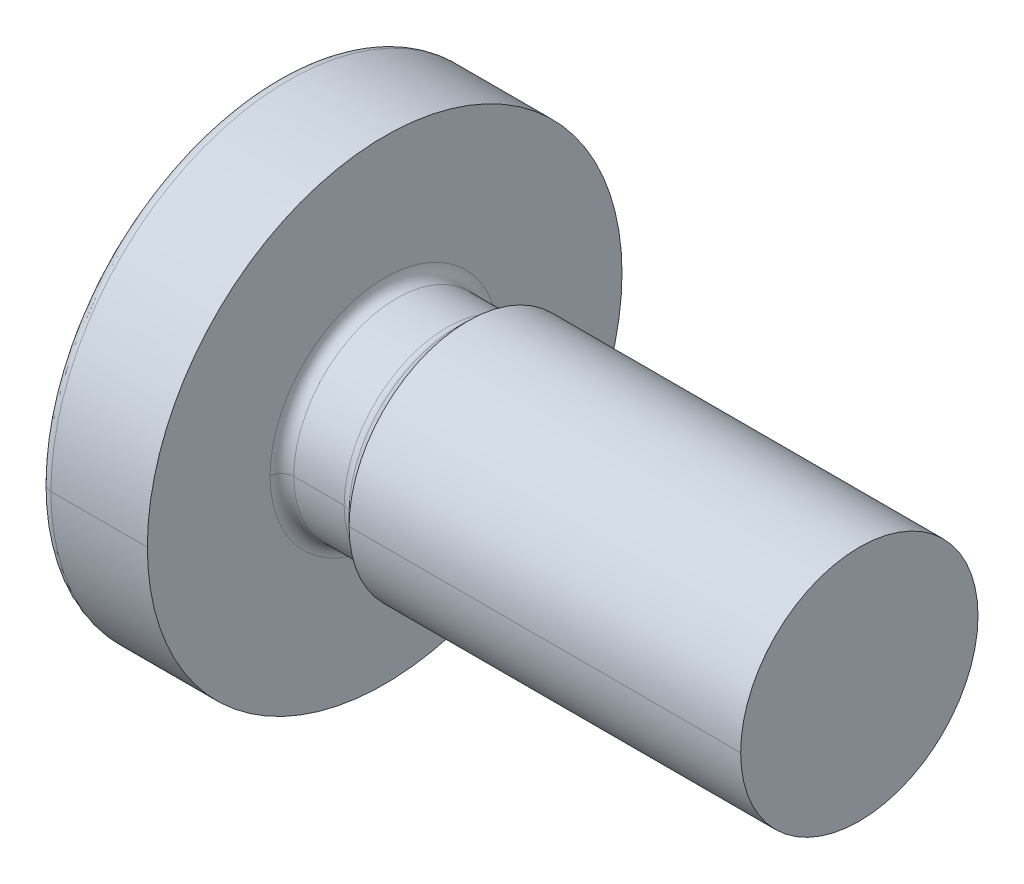
ISO-10303-21;
HEADER;
FILE_DESCRIPTION(('STEP AP214'),'2;1');
FILE_NAME('part.step','',(''),(''),'','','');
FILE_SCHEMA(('AUTOMOTIVE_DESIGN { 1 0 10303 214 1 1 1 1 }'));
ENDSEC;
DATA;
#1=APPLICATION_CONTEXT('core data for automotive mechanical design processes');
#2=APPLICATION_PROTOCOL_DEFINITION('international standard','automotive_design',2000,#1);
#3=PRODUCT_CONTEXT('',#1,'mechanical');
#4=PRODUCT('Part','Part','',(#3));
#5=PRODUCT_RELATED_PRODUCT_CATEGORY('part','',(#4));
#6=PRODUCT_DEFINITION_FORMATION('','',#4);
#7=PRODUCT_DEFINITION_CONTEXT('part definition',#1,'design');
#8=PRODUCT_DEFINITION('design','',#6,#7);
#9=PRODUCT_DEFINITION_SHAPE('','',#8);
#10=(LENGTH_UNIT() NAMED_UNIT(*) SI_UNIT(.MILLI.,.METRE.));
#11=(NAMED_UNIT(*) PLANE_ANGLE_UNIT() SI_UNIT($,.RADIAN.));
#12=(NAMED_UNIT(*) SI_UNIT($,.STERADIAN.) SOLID_ANGLE_UNIT());
#13=UNCERTAINTY_MEASURE_WITH_UNIT(LENGTH_MEASURE(1.E-05),#10,'distance_accuracy_value','');
#14=(GEOMETRIC_REPRESENTATION_CONTEXT(3) GLOBAL_UNCERTAINTY_ASSIGNED_CONTEXT((#13)) GLOBAL_UNIT_ASSIGNED_CONTEXT((#10,
#11,#12)) REPRESENTATION_CONTEXT('',''));
#15=CARTESIAN_POINT('',(0.,0.,0.));
#16=DIRECTION('',(0.,0.,1.));
#17=DIRECTION('',(1.,0.,0.));
#18=AXIS2_PLACEMENT_3D('',#15,#16,#17);
#19=CARTESIAN_POINT('',(3.3,0.,0.));
#20=DIRECTION('',(-1.,0.,0.));
#21=DIRECTION('',(0.,0.,1.));
#22=AXIS2_PLACEMENT_3D('',#19,#20,#21);
#23=TOROIDAL_SURFACE('',#22,1.932,0.2);
#24=CARTESIAN_POINT('',(3.1,0.,0.));
#25=DIRECTION('',(-1.,0.,0.));
#26=DIRECTION('',(0.,0.,1.));
#27=AXIS2_PLACEMENT_3D('',#24,#25,#26);
#28=CIRCLE('',#27,1.932);
#29=CARTESIAN_POINT('',(3.1,0.,-1.932));
#30=VERTEX_POINT('',#29);
#31=CARTESIAN_POINT('',(3.1,0.,1.932));
#32=VERTEX_POINT('',#31);
#33=EDGE_CURVE('E38',#30,#32,#28,.T.);
#34=ORIENTED_EDGE('',*,*,#33,.F.);
#35=CARTESIAN_POINT('',(3.3,0.,-1.932));
#36=DIRECTION('',(0.,1.,0.));
#37=DIRECTION('',(0.,0.,1.));
#38=AXIS2_PLACEMENT_3D('',#35,#36,#37);
#39=CIRCLE('',#38,0.2);
#40=CARTESIAN_POINT('',(3.3,0.,-1.732));
#41=VERTEX_POINT('',#40);
#42=EDGE_CURVE('E10',#30,#41,#39,.T.);
#43=ORIENTED_EDGE('',*,*,#42,.T.);
#44=CARTESIAN_POINT('',(3.3,0.,0.));
#45=DIRECTION('',(1.,0.,0.));
#46=DIRECTION('',(0.,0.,1.));
#47=AXIS2_PLACEMENT_3D('',#44,#45,#46);
#48=CIRCLE('',#47,1.732);
#49=CARTESIAN_POINT('',(3.3,0.,1.732));
#50=VERTEX_POINT('',#49);
#51=EDGE_CURVE('E52',#50,#41,#48,.T.);
#52=ORIENTED_EDGE('',*,*,#51,.F.);
#53=CARTESIAN_POINT('',(3.3,0.,1.932));
#54=DIRECTION('',(0.,-1.,0.));
#55=DIRECTION('',(0.,0.,-1.));
#56=AXIS2_PLACEMENT_3D('',#53,#54,#55);
#57=CIRCLE('',#56,0.2);
#58=EDGE_CURVE('E259',#32,#50,#57,.T.);
#59=ORIENTED_EDGE('',*,*,#58,.F.);
#60=EDGE_LOOP('',(#34,#43,#52,#59));
#61=FACE_BOUND('',#60,.T.);
#62=ADVANCED_FACE('F15',(#61),#23,.F.);
#63=CARTESIAN_POINT('',(4.14915728752538,0.,0.));
#64=DIRECTION('',(-1.,0.,0.));
#65=DIRECTION('',(0.,0.,1.));
#66=AXIS2_PLACEMENT_3D('',#63,#64,#65);
#67=TOROIDAL_SURFACE('',#66,1.932,0.2);
#68=CARTESIAN_POINT('',(4.14915728752538,0.,0.));
#69=DIRECTION('',(-1.,0.,0.));
#70=DIRECTION('',(0.,0.,1.));
#71=AXIS2_PLACEMENT_3D('',#68,#69,#70);
#72=CIRCLE('',#71,1.732);
#73=CARTESIAN_POINT('',(4.14915728752538,0.,-1.732));
#74=VERTEX_POINT('',#73);
#75=CARTESIAN_POINT('',(4.14915728752538,0.,1.732));
#76=VERTEX_POINT('',#75);
#77=EDGE_CURVE('E436',#74,#76,#72,.T.);
#78=ORIENTED_EDGE('',*,*,#77,.F.);
#79=CARTESIAN_POINT('',(4.14915728752538,0.,-1.932));
#80=DIRECTION('',(0.,1.,0.));
#81=DIRECTION('',(0.,0.,1.));
#82=AXIS2_PLACEMENT_3D('',#79,#80,#81);
#83=CIRCLE('',#82,0.2);
#84=CARTESIAN_POINT('',(4.29057864376269,0.,-1.79057864376269));
#85=VERTEX_POINT('',#84);
#86=EDGE_CURVE('E25',#74,#85,#83,.T.);
#87=ORIENTED_EDGE('',*,*,#86,.T.);
#88=CARTESIAN_POINT('',(4.29057864376269,0.,0.));
#89=DIRECTION('',(1.,0.,0.));
#90=DIRECTION('',(0.,0.,-1.));
#91=AXIS2_PLACEMENT_3D('',#88,#89,#90);
#92=CIRCLE('',#91,1.79057864376269);
#93=CARTESIAN_POINT('',(4.29057864376269,0.,1.79057864376269));
#94=VERTEX_POINT('',#93);
#95=EDGE_CURVE('E457',#94,#85,#92,.T.);
#96=ORIENTED_EDGE('',*,*,#95,.F.);
#97=CARTESIAN_POINT('',(4.14915728752538,0.,1.932));
#98=DIRECTION('',(0.,-1.,0.));
#99=DIRECTION('',(0.,0.,-1.));
#100=AXIS2_PLACEMENT_3D('',#97,#98,#99);
#101=CIRCLE('',#100,0.2);
#102=EDGE_CURVE('E262',#76,#94,#101,.T.);
#103=ORIENTED_EDGE('',*,*,#102,.F.);
#104=EDGE_LOOP('',(#78,#87,#96,#103));
#105=FACE_BOUND('',#104,.T.);
#106=ADVANCED_FACE('F1135',(#105),#67,.F.);
#107=CARTESIAN_POINT('',(1.47506218943955,0.,0.));
#108=DIRECTION('',(1.,0.,0.));
#109=DIRECTION('',(0.,0.,-1.));
#110=AXIS2_PLACEMENT_3D('',#107,#108,#109);
#111=TOROIDAL_SURFACE('',#110,3.8,0.2);
#112=CARTESIAN_POINT('',(1.31554035418367,0.,0.));
#113=DIRECTION('',(-1.,0.,0.));
#114=DIRECTION('',(0.,0.,-1.));
#115=AXIS2_PLACEMENT_3D('',#112,#113,#114);
#116=CIRCLE('',#115,3.92063492063492);
#117=CARTESIAN_POINT('',(1.31554035418367,0.,3.92063492063492));
#118=VERTEX_POINT('',#117);
#119=CARTESIAN_POINT('',(1.31554035418367,3.92063492063492,0.));
#120=VERTEX_POINT('',#119);
#121=EDGE_CURVE('E300',#118,#120,#116,.T.);
#122=ORIENTED_EDGE('',*,*,#121,.F.);
#123=CARTESIAN_POINT('',(1.47506218943955,0.,3.8));
#124=DIRECTION('',(0.,1.,0.));
#125=DIRECTION('',(0.,0.,1.));
#126=AXIS2_PLACEMENT_3D('',#123,#124,#125);
#127=CIRCLE('',#126,0.2);
#128=CARTESIAN_POINT('',(1.47506218943955,0.,4.));
#129=VERTEX_POINT('',#128);
#130=EDGE_CURVE('E539',#118,#129,#127,.T.);
#131=ORIENTED_EDGE('',*,*,#130,.T.);
#132=CARTESIAN_POINT('',(1.47506218943955,0.,0.));
#133=DIRECTION('',(1.,0.,0.));
#134=DIRECTION('',(0.,0.,-1.));
#135=AXIS2_PLACEMENT_3D('',#132,#133,#134);
#136=CIRCLE('',#135,4.);
#137=CARTESIAN_POINT('',(1.47506218943955,0.,-4.));
#138=VERTEX_POINT('',#137);
#139=EDGE_CURVE('E304',#138,#129,#136,.T.);
#140=ORIENTED_EDGE('',*,*,#139,.F.);
#141=CARTESIAN_POINT('',(1.47506218943955,0.,-3.8));
#142=DIRECTION('',(0.,-1.,0.));
#143=DIRECTION('',(0.,0.,-1.));
#144=AXIS2_PLACEMENT_3D('',#141,#142,#143);
#145=CIRCLE('',#144,0.2);
#146=CARTESIAN_POINT('',(1.31554035418367,0.,-3.92063492063492));
#147=VERTEX_POINT('',#146);
#148=EDGE_CURVE('E310',#147,#138,#145,.T.);
#149=ORIENTED_EDGE('',*,*,#148,.F.);
#150=CARTESIAN_POINT('',(1.31554035418367,0.,0.));
#151=DIRECTION('',(-1.,0.,0.));
#152=DIRECTION('',(0.,0.,-1.));
#153=AXIS2_PLACEMENT_3D('',#150,#151,#152);
#154=CIRCLE('',#153,3.92063492063492);
#155=EDGE_CURVE('E309',#120,#147,#154,.T.);
#156=ORIENTED_EDGE('',*,*,#155,.F.);
#157=EDGE_LOOP('',(#122,#131,#140,#149,#156));
#158=FACE_BOUND('',#157,.T.);
#159=ADVANCED_FACE('F605',(#158),#111,.T.);
#160=CARTESIAN_POINT('',(-3.4420013783492,0.,0.));
#161=DIRECTION('',(-1.,0.,0.));
#162=DIRECTION('',(0.,0.,1.));
#163=AXIS2_PLACEMENT_3D('',#160,#161,#162);
#164=CYLINDRICAL_SURFACE('',#163,2.);
#165=CARTESIAN_POINT('',(11.1,0.,0.));
#166=DIRECTION('',(-1.,0.,0.));
#167=DIRECTION('',(0.,0.,1.));
#168=AXIS2_PLACEMENT_3D('',#165,#166,#167);
#169=CIRCLE('',#168,2.);
#170=CARTESIAN_POINT('',(11.1,0.,2.));
#171=VERTEX_POINT('',#170);
#172=CARTESIAN_POINT('',(11.1,0.,-2.));
#173=VERTEX_POINT('',#172);
#174=EDGE_CURVE('E523',#171,#173,#169,.T.);
#175=ORIENTED_EDGE('',*,*,#174,.T.);
#176=DIRECTION('',(-1.,0.,0.));
#177=VECTOR('',#176,1.);
#178=CARTESIAN_POINT('',(-3.4420013783492,0.,-2.));
#179=LINE('',#178,#177);
#180=CARTESIAN_POINT('',(4.5,0.,-2.));
#181=VERTEX_POINT('',#180);
#182=EDGE_CURVE('E274',#173,#181,#179,.T.);
#183=ORIENTED_EDGE('',*,*,#182,.T.);
#184=CARTESIAN_POINT('',(4.5,0.,0.));
#185=DIRECTION('',(-1.,0.,0.));
#186=DIRECTION('',(0.,0.,1.));
#187=AXIS2_PLACEMENT_3D('',#184,#185,#186);
#188=CIRCLE('',#187,2.);
#189=CARTESIAN_POINT('',(4.5,0.,2.));
#190=VERTEX_POINT('',#189);
#191=EDGE_CURVE('E423',#190,#181,#188,.T.);
#192=ORIENTED_EDGE('',*,*,#191,.F.);
#193=DIRECTION('',(-1.,0.,0.));
#194=VECTOR('',#193,1.);
#195=CARTESIAN_POINT('',(-3.4420013783492,0.,2.));
#196=LINE('',#195,#194);
#197=EDGE_CURVE('E281',#171,#190,#196,.T.);
#198=ORIENTED_EDGE('',*,*,#197,.F.);
#199=EDGE_LOOP('',(#175,#183,#192,#198));
#200=FACE_BOUND('',#199,.T.);
#201=ADVANCED_FACE('F1146',(#200),#164,.T.);
#202=CARTESIAN_POINT('',(4.5,0.,0.));
#203=DIRECTION('',(1.,0.,0.));
#204=DIRECTION('',(0.,0.,-1.));
#205=AXIS2_PLACEMENT_3D('',#202,#203,#204);
#206=CONICAL_SURFACE('',#205,2.,0.785398163397442);
#207=CARTESIAN_POINT('',(4.29057864376269,0.,0.));
#208=DIRECTION('',(1.,0.,0.));
#209=DIRECTION('',(0.,0.,-1.));
#210=AXIS2_PLACEMENT_3D('',#207,#208,#209);
#211=CIRCLE('',#210,1.79057864376269);
#212=EDGE_CURVE('E270',#85,#94,#211,.T.);
#213=ORIENTED_EDGE('',*,*,#212,.T.);
#214=DIRECTION('',(0.707106781186552,0.,0.707106781186543));
#215=VECTOR('',#214,1.);
#216=CARTESIAN_POINT('',(4.5,0.,2.));
#217=LINE('',#216,#215);
#218=EDGE_CURVE('E275',#94,#190,#217,.T.);
#219=ORIENTED_EDGE('',*,*,#218,.T.);
#220=ORIENTED_EDGE('',*,*,#191,.T.);
#221=DIRECTION('',(0.707106781186552,0.,-0.707106781186543));
#222=VECTOR('',#221,1.);
#223=CARTESIAN_POINT('',(4.5,0.,-2.));
#224=LINE('',#223,#222);
#225=EDGE_CURVE('E453',#85,#181,#224,.T.);
#226=ORIENTED_EDGE('',*,*,#225,.F.);
#227=EDGE_LOOP('',(#213,#219,#220,#226));
#228=FACE_BOUND('',#227,.T.);
#229=ADVANCED_FACE('F1151',(#228),#206,.T.);
#230=CARTESIAN_POINT('',(-3.4420013783492,0.,0.));
#231=DIRECTION('',(-1.,0.,0.));
#232=DIRECTION('',(0.,0.,1.));
#233=AXIS2_PLACEMENT_3D('',#230,#231,#232);
#234=CYLINDRICAL_SURFACE('',#233,1.732);
#235=CARTESIAN_POINT('',(4.14915728752538,0.,0.));
#236=DIRECTION('',(-1.,0.,0.));
#237=DIRECTION('',(0.,0.,1.));
#238=AXIS2_PLACEMENT_3D('',#235,#236,#237);
#239=CIRCLE('',#238,1.732);
#240=EDGE_CURVE('E409',#76,#74,#239,.T.);
#241=ORIENTED_EDGE('',*,*,#240,.T.);
#242=DIRECTION('',(-1.,0.,0.));
#243=VECTOR('',#242,1.);
#244=CARTESIAN_POINT('',(-3.4420013783492,0.,-1.732));
#245=LINE('',#244,#243);
#246=EDGE_CURVE('E406',#74,#41,#245,.T.);
#247=ORIENTED_EDGE('',*,*,#246,.T.);
#248=CARTESIAN_POINT('',(3.3,0.,0.));
#249=DIRECTION('',(1.,0.,0.));
#250=DIRECTION('',(0.,0.,1.));
#251=AXIS2_PLACEMENT_3D('',#248,#249,#250);
#252=CIRCLE('',#251,1.732);
#253=EDGE_CURVE('E391',#41,#50,#252,.T.);
#254=ORIENTED_EDGE('',*,*,#253,.T.);
#255=DIRECTION('',(-1.,0.,0.));
#256=VECTOR('',#255,1.);
#257=CARTESIAN_POINT('',(-3.4420013783492,0.,1.732));
#258=LINE('',#257,#256);
#259=EDGE_CURVE('E439',#76,#50,#258,.T.);
#260=ORIENTED_EDGE('',*,*,#259,.F.);
#261=EDGE_LOOP('',(#241,#247,#254,#260));
#262=FACE_BOUND('',#261,.T.);
#263=ADVANCED_FACE('F1088',(#262),#234,.T.);
#264=CARTESIAN_POINT('',(-3.4420013783492,0.,0.));
#265=DIRECTION('',(-1.,0.,0.));
#266=DIRECTION('',(0.,0.,1.));
#267=AXIS2_PLACEMENT_3D('',#264,#265,#266);
#268=CYLINDRICAL_SURFACE('',#267,4.);
#269=CARTESIAN_POINT('',(3.1,0.,0.));
#270=DIRECTION('',(-1.,0.,0.));
#271=DIRECTION('',(0.,0.,1.));
#272=AXIS2_PLACEMENT_3D('',#269,#270,#271);
#273=CIRCLE('',#272,4.);
#274=CARTESIAN_POINT('',(3.1,0.,4.));
#275=VERTEX_POINT('',#274);
#276=CARTESIAN_POINT('',(3.1,0.,-4.));
#277=VERTEX_POINT('',#276);
#278=EDGE_CURVE('E387',#275,#277,#273,.T.);
#279=ORIENTED_EDGE('',*,*,#278,.T.);
#280=DIRECTION('',(-1.,0.,0.));
#281=VECTOR('',#280,1.);
#282=CARTESIAN_POINT('',(-3.4420013783492,0.,-4.));
#283=LINE('',#282,#281);
#284=EDGE_CURVE('E308',#277,#138,#283,.T.);
#285=ORIENTED_EDGE('',*,*,#284,.T.);
#286=ORIENTED_EDGE('',*,*,#139,.T.);
#287=DIRECTION('',(-1.,0.,0.));
#288=VECTOR('',#287,1.);
#289=CARTESIAN_POINT('',(-3.4420013783492,0.,4.));
#290=LINE('',#289,#288);
#291=EDGE_CURVE('E282',#275,#129,#290,.T.);
#292=ORIENTED_EDGE('',*,*,#291,.F.);
#293=EDGE_LOOP('',(#279,#285,#286,#292));
#294=FACE_BOUND('',#293,.T.);
#295=ADVANCED_FACE('F608',(#294),#268,.T.);
#296=CARTESIAN_POINT('',(6.5,0.,0.));
#297=DIRECTION('',(0.,0.,-1.));
#298=DIRECTION('',(0.,1.,0.));
#299=AXIS2_PLACEMENT_3D('',#296,#297,#298);
#300=SPHERICAL_SURFACE('',#299,6.5);
#301=ORIENTED_EDGE('',*,*,#155,.T.);
#302=CARTESIAN_POINT('',(1.31554035418367,0.,0.));
#303=DIRECTION('',(-1.,0.,0.));
#304=DIRECTION('',(0.,0.,-1.));
#305=AXIS2_PLACEMENT_3D('',#302,#303,#304);
#306=CIRCLE('',#305,3.92063492063492);
#307=CARTESIAN_POINT('',(1.31554035418367,-3.92063492063492,0.));
#308=VERTEX_POINT('',#307);
#309=EDGE_CURVE('E320',#147,#308,#306,.T.);
#310=ORIENTED_EDGE('',*,*,#309,.T.);
#311=CARTESIAN_POINT('',(6.5,0.,0.));
#312=DIRECTION('',(0.,0.,-1.));
#313=DIRECTION('',(0.,1.,0.));
#314=AXIS2_PLACEMENT_3D('',#311,#312,#313);
#315=CIRCLE('',#314,6.5);
#316=CARTESIAN_POINT('',(0.0700305769772277,-0.951574074359006,0.));
#317=VERTEX_POINT('',#316);
#318=EDGE_CURVE('E235',#308,#317,#315,.T.);
#319=ORIENTED_EDGE('',*,*,#318,.T.);
#320=CARTESIAN_POINT('',(6.52789360657738,-0.292360173838381,0.112226556013255));
#321=DIRECTION('',(0.0887201386737615,-0.929898939158986,0.356954758960714));
#322=DIRECTION('',(0.,-0.358367949545295,-0.933580426497204));
#323=AXIS2_PLACEMENT_3D('',#320,#321,#322);
#324=CIRCLE('',#323,6.49239190711641);
#325=CARTESIAN_POINT('',(0.141888285622446,-1.1900033192439,-0.638989457439414));
#326=VERTEX_POINT('',#325);
#327=EDGE_CURVE('E227',#317,#326,#324,.T.);
#328=ORIENTED_EDGE('',*,*,#327,.T.);
#329=CARTESIAN_POINT('',(6.49834511100712,0.0173453236425445,-0.0167501843370009));
#330=DIRECTION('',(0.0684699703771079,-0.717651637719428,0.693028130767562));
#331=DIRECTION('',(0.,-0.694658370458996,-0.719339800338652));
#332=AXIS2_PLACEMENT_3D('',#329,#330,#331);
#333=CIRCLE('',#332,6.49995506387658);
#334=CARTESIAN_POINT('',(0.368688551321991,-1.75882202008378,-1.25042593582281));
#335=VERTEX_POINT('',#334);
#336=EDGE_CURVE('E218',#326,#335,#333,.T.);
#337=ORIENTED_EDGE('',*,*,#336,.T.);
#338=CARTESIAN_POINT('',(6.12899407355305,0.526174253500917,0.526174253500917));
#339=DIRECTION('',(-0.44619781450503,0.63281415531376,0.63281415531376));
#340=DIRECTION('',(0.,-0.707106781186548,0.707106781186547));
#341=AXIS2_PLACEMENT_3D('',#338,#339,#340);
#342=CIRCLE('',#341,6.44659878637152);
#343=CARTESIAN_POINT('',(0.368688551617876,-1.25042593573104,-1.75882201996693));
#344=VERTEX_POINT('',#343);
#345=EDGE_CURVE('E245',#344,#335,#342,.T.);
#346=ORIENTED_EDGE('',*,*,#345,.F.);
#347=CARTESIAN_POINT('',(6.49834511100712,-0.0167501843369975,0.017345323642541));
#348=DIRECTION('',(0.0684699703771073,0.693028130767561,-0.717651637719429));
#349=DIRECTION('',(0.,0.719339800338653,0.694658370458995));
#350=AXIS2_PLACEMENT_3D('',#347,#348,#349);
#351=CIRCLE('',#350,6.49995506387658);
#352=CARTESIAN_POINT('',(0.14188828559706,-0.638989457439414,-1.19000331924632));
#353=VERTEX_POINT('',#352);
#354=EDGE_CURVE('E228',#344,#353,#351,.T.);
#355=ORIENTED_EDGE('',*,*,#354,.T.);
#356=CARTESIAN_POINT('',(6.52789360657738,0.112226556013256,-0.292360173838384));
#357=DIRECTION('',(0.0887201386737611,0.356954758960714,-0.929898939158986));
#358=DIRECTION('',(0.,0.933580426497204,0.358367949545294));
#359=AXIS2_PLACEMENT_3D('',#356,#357,#358);
#360=CIRCLE('',#359,6.49239190711642);
#361=CARTESIAN_POINT('',(0.0700305769772277,0.,-0.951574074359006));
#362=VERTEX_POINT('',#361);
#363=EDGE_CURVE('E355',#353,#362,#360,.T.);
#364=ORIENTED_EDGE('',*,*,#363,.T.);
#365=CARTESIAN_POINT('',(6.52789360657738,-0.112226556013255,-0.292360173838382));
#366=DIRECTION('',(0.0887201386737613,-0.356954758960714,-0.929898939158986));
#367=DIRECTION('',(0.,0.933580426497204,-0.358367949545294));
#368=AXIS2_PLACEMENT_3D('',#365,#366,#367);
#369=CIRCLE('',#368,6.49239190711642);
#370=CARTESIAN_POINT('',(0.141888285622446,0.638989457439414,-1.1900033192439));
#371=VERTEX_POINT('',#370);
#372=EDGE_CURVE('E359',#362,#371,#369,.T.);
#373=ORIENTED_EDGE('',*,*,#372,.T.);
#374=CARTESIAN_POINT('',(6.49834511100712,0.016750184336999,0.0173453236425425));
#375=DIRECTION('',(0.0684699703771076,-0.693028130767562,-0.717651637719428));
#376=DIRECTION('',(0.,0.719339800338653,-0.694658370458996));
#377=AXIS2_PLACEMENT_3D('',#374,#375,#376);
#378=CIRCLE('',#377,6.49995506387658);
#379=CARTESIAN_POINT('',(0.36868855132199,1.25042593582281,-1.75882202008378));
#380=VERTEX_POINT('',#379);
#381=EDGE_CURVE('E413',#371,#380,#378,.T.);
#382=ORIENTED_EDGE('',*,*,#381,.T.);
#383=CARTESIAN_POINT('',(6.12899407355305,-0.526174253500917,0.526174253500917));
#384=DIRECTION('',(-0.44619781450503,-0.63281415531376,0.63281415531376));
#385=DIRECTION('',(0.,-0.707106781186548,-0.707106781186547));
#386=AXIS2_PLACEMENT_3D('',#383,#384,#385);
#387=CIRCLE('',#386,6.44659878637152);
#388=CARTESIAN_POINT('',(0.368688551321992,1.75882202008378,-1.25042593582281));
#389=VERTEX_POINT('',#388);
#390=EDGE_CURVE('E444',#389,#380,#387,.T.);
#391=ORIENTED_EDGE('',*,*,#390,.F.);
#392=CARTESIAN_POINT('',(6.49834511100712,-0.0173453236425436,-0.0167501843370001));
#393=DIRECTION('',(0.0684699703771077,0.717651637719428,0.693028130767562));
#394=DIRECTION('',(0.,-0.694658370458996,0.719339800338652));
#395=AXIS2_PLACEMENT_3D('',#392,#393,#394);
#396=CIRCLE('',#395,6.49995506387658);
#397=CARTESIAN_POINT('',(0.141888285597059,1.19000331924632,-0.638989457439414));
#398=VERTEX_POINT('',#397);
#399=EDGE_CURVE('E380',#389,#398,#396,.T.);
#400=ORIENTED_EDGE('',*,*,#399,.T.);
#401=CARTESIAN_POINT('',(6.52789360657738,0.292360173838382,0.112226556013255));
#402=DIRECTION('',(0.0887201386737614,0.929898939158986,0.356954758960714));
#403=DIRECTION('',(0.,-0.358367949545294,0.933580426497204));
#404=AXIS2_PLACEMENT_3D('',#401,#402,#403);
#405=CIRCLE('',#404,6.49239190711642);
#406=CARTESIAN_POINT('',(0.0700305769772277,0.951574074359006,0.));
#407=VERTEX_POINT('',#406);
#408=EDGE_CURVE('E376',#398,#407,#405,.T.);
#409=ORIENTED_EDGE('',*,*,#408,.T.);
#410=CARTESIAN_POINT('',(6.5,0.,0.));
#411=DIRECTION('',(0.,0.,1.));
#412=DIRECTION('',(1.,0.,0.));
#413=AXIS2_PLACEMENT_3D('',#410,#411,#412);
#414=CIRCLE('',#413,6.5);
#415=EDGE_CURVE('E291',#120,#407,#414,.T.);
#416=ORIENTED_EDGE('',*,*,#415,.F.);
#417=EDGE_LOOP('',(#301,#310,#319,#328,#337,#346,#355,#364,#373,#382,#391,#400,#409,#416));
#418=FACE_BOUND('',#417,.T.);
#419=ADVANCED_FACE('F233',(#418),#300,.T.);
#420=CARTESIAN_POINT('',(6.5,0.,0.));
#421=DIRECTION('',(0.,0.,-1.));
#422=DIRECTION('',(0.,1.,0.));
#423=AXIS2_PLACEMENT_3D('',#420,#421,#422);
#424=SPHERICAL_SURFACE('',#423,6.5);
#425=ORIENTED_EDGE('',*,*,#318,.F.);
#426=CARTESIAN_POINT('',(1.31554035418367,0.,0.));
#427=DIRECTION('',(-1.,0.,0.));
#428=DIRECTION('',(0.,0.,-1.));
#429=AXIS2_PLACEMENT_3D('',#426,#427,#428);
#430=CIRCLE('',#429,3.92063492063492);
#431=EDGE_CURVE('E381',#308,#118,#430,.T.);
#432=ORIENTED_EDGE('',*,*,#431,.T.);
#433=ORIENTED_EDGE('',*,*,#121,.T.);
#434=ORIENTED_EDGE('',*,*,#415,.T.);
#435=CARTESIAN_POINT('',(6.52789360657738,0.292360173838382,-0.112226556013255));
#436=DIRECTION('',(0.0887201386737614,0.929898939158986,-0.356954758960714));
#437=DIRECTION('',(0.,0.358367949545294,0.933580426497204));
#438=AXIS2_PLACEMENT_3D('',#435,#436,#437);
#439=CIRCLE('',#438,6.49239190711642);
#440=CARTESIAN_POINT('',(0.141888285622446,1.1900033192439,0.638989457439414));
#441=VERTEX_POINT('',#440);
#442=EDGE_CURVE('E287',#407,#441,#439,.T.);
#443=ORIENTED_EDGE('',*,*,#442,.T.);
#444=CARTESIAN_POINT('',(6.49834511100712,-0.0173453236425439,0.0167501843370004));
#445=DIRECTION('',(0.0684699703771078,0.717651637719428,-0.693028130767562));
#446=DIRECTION('',(0.,0.694658370458996,0.719339800338652));
#447=AXIS2_PLACEMENT_3D('',#444,#445,#446);
#448=CIRCLE('',#447,6.49995506387658);
#449=CARTESIAN_POINT('',(0.368688551321992,1.75882202008378,1.25042593582281));
#450=VERTEX_POINT('',#449);
#451=EDGE_CURVE('E292',#441,#450,#448,.T.);
#452=ORIENTED_EDGE('',*,*,#451,.T.);
#453=CARTESIAN_POINT('',(6.12899407355305,-0.526174253500917,-0.526174253500917));
#454=DIRECTION('',(-0.44619781450503,-0.63281415531376,-0.63281415531376));
#455=DIRECTION('',(0.,0.707106781186548,-0.707106781186547));
#456=AXIS2_PLACEMENT_3D('',#453,#454,#455);
#457=CIRCLE('',#456,6.44659878637152);
#458=CARTESIAN_POINT('',(0.368688551617876,1.25042593573104,1.75882201996693));
#459=VERTEX_POINT('',#458);
#460=EDGE_CURVE('E264',#459,#450,#457,.T.);
#461=ORIENTED_EDGE('',*,*,#460,.F.);
#462=CARTESIAN_POINT('',(6.49834511100712,0.0167501843369989,-0.0173453236425424));
#463=DIRECTION('',(0.0684699703771076,-0.693028130767562,0.717651637719428));
#464=DIRECTION('',(0.,-0.719339800338653,-0.694658370458996));
#465=AXIS2_PLACEMENT_3D('',#462,#463,#464);
#466=CIRCLE('',#465,6.49995506387658);
#467=CARTESIAN_POINT('',(0.141888285597059,0.638989457439414,1.19000331924632));
#468=VERTEX_POINT('',#467);
#469=EDGE_CURVE('E368',#459,#468,#466,.T.);
#470=ORIENTED_EDGE('',*,*,#469,.T.);
#471=CARTESIAN_POINT('',(6.52789360657738,-0.112226556013255,0.292360173838382));
#472=DIRECTION('',(0.0887201386737613,-0.356954758960714,0.929898939158986));
#473=DIRECTION('',(0.,-0.933580426497204,-0.358367949545294));
#474=AXIS2_PLACEMENT_3D('',#471,#472,#473);
#475=CIRCLE('',#474,6.49239190711642);
#476=CARTESIAN_POINT('',(0.0700305769772283,0.,0.951574074359006));
#477=VERTEX_POINT('',#476);
#478=EDGE_CURVE('E364',#468,#477,#475,.T.);
#479=ORIENTED_EDGE('',*,*,#478,.T.);
#480=CARTESIAN_POINT('',(6.52789360657738,0.112226556013256,0.292360173838384));
#481=DIRECTION('',(0.0887201386737611,0.356954758960714,0.929898939158986));
#482=DIRECTION('',(0.,-0.933580426497204,0.358367949545294));
#483=AXIS2_PLACEMENT_3D('',#480,#481,#482);
#484=CIRCLE('',#483,6.49239190711642);
#485=CARTESIAN_POINT('',(0.141888285622445,-0.638989457439414,1.1900033192439));
#486=VERTEX_POINT('',#485);
#487=EDGE_CURVE('E353',#477,#486,#484,.T.);
#488=ORIENTED_EDGE('',*,*,#487,.T.);
#489=CARTESIAN_POINT('',(6.49834511100712,-0.0167501843369975,-0.017345323642541));
#490=DIRECTION('',(0.0684699703771073,0.693028130767561,0.717651637719429));
#491=DIRECTION('',(0.,-0.719339800338653,0.694658370458995));
#492=AXIS2_PLACEMENT_3D('',#489,#490,#491);
#493=CIRCLE('',#492,6.49995506387658);
#494=CARTESIAN_POINT('',(0.368688551321991,-1.25042593582281,1.75882202008378));
#495=VERTEX_POINT('',#494);
#496=EDGE_CURVE('E349',#486,#495,#493,.T.);
#497=ORIENTED_EDGE('',*,*,#496,.T.);
#498=CARTESIAN_POINT('',(6.12899407355305,0.526174253500917,-0.526174253500917));
#499=DIRECTION('',(-0.44619781450503,0.63281415531376,-0.63281415531376));
#500=DIRECTION('',(0.,0.707106781186548,0.707106781186547));
#501=AXIS2_PLACEMENT_3D('',#498,#499,#500);
#502=CIRCLE('',#501,6.44659878637152);
#503=CARTESIAN_POINT('',(0.368688551617877,-1.75882201996693,1.25042593573104));
#504=VERTEX_POINT('',#503);
#505=EDGE_CURVE('E319',#504,#495,#502,.T.);
#506=ORIENTED_EDGE('',*,*,#505,.F.);
#507=CARTESIAN_POINT('',(6.49834511100712,0.0173453236425442,0.0167501843370007));
#508=DIRECTION('',(0.0684699703771078,-0.717651637719428,-0.693028130767562));
#509=DIRECTION('',(0.,0.694658370458996,-0.719339800338652));
#510=AXIS2_PLACEMENT_3D('',#507,#508,#509);
#511=CIRCLE('',#510,6.49995506387658);
#512=CARTESIAN_POINT('',(0.141888285597059,-1.19000331924632,0.638989457439414));
#513=VERTEX_POINT('',#512);
#514=EDGE_CURVE('E354',#504,#513,#511,.T.);
#515=ORIENTED_EDGE('',*,*,#514,.T.);
#516=CARTESIAN_POINT('',(6.52789360657738,-0.292360173838381,-0.112226556013255));
#517=DIRECTION('',(0.0887201386737615,-0.929898939158986,-0.356954758960714));
#518=DIRECTION('',(0.,0.358367949545294,-0.933580426497204));
#519=AXIS2_PLACEMENT_3D('',#516,#517,#518);
#520=CIRCLE('',#519,6.49239190711642);
#521=EDGE_CURVE('E414',#513,#317,#520,.T.);
#522=ORIENTED_EDGE('',*,*,#521,.T.);
#523=EDGE_LOOP('',(#425,#432,#433,#434,#443,#452,#461,#470,#479,#488,#497,#506,#515,#522));
#524=FACE_BOUND('',#523,.T.);
#525=ADVANCED_FACE('F576',(#524),#424,.T.);
#526=CARTESIAN_POINT('',(-3.4420013783492,0.,0.));
#527=DIRECTION('',(-1.,0.,0.));
#528=DIRECTION('',(0.,0.,1.));
#529=AXIS2_PLACEMENT_3D('',#526,#527,#528);
#530=CYLINDRICAL_SURFACE('',#529,4.);
#531=ORIENTED_EDGE('',*,*,#284,.F.);
#532=CARTESIAN_POINT('',(3.1,0.,0.));
#533=DIRECTION('',(-1.,0.,0.));
#534=DIRECTION('',(0.,0.,1.));
#535=AXIS2_PLACEMENT_3D('',#532,#533,#534);
#536=CIRCLE('',#535,4.);
#537=EDGE_CURVE('E284',#277,#275,#536,.T.);
#538=ORIENTED_EDGE('',*,*,#537,.T.);
#539=ORIENTED_EDGE('',*,*,#291,.T.);
#540=CARTESIAN_POINT('',(1.47506218943955,0.,0.));
#541=DIRECTION('',(1.,0.,0.));
#542=DIRECTION('',(0.,0.,-1.));
#543=AXIS2_PLACEMENT_3D('',#540,#541,#542);
#544=CIRCLE('',#543,4.);
#545=EDGE_CURVE('E285',#129,#138,#544,.T.);
#546=ORIENTED_EDGE('',*,*,#545,.T.);
#547=EDGE_LOOP('',(#531,#538,#539,#546));
#548=FACE_BOUND('',#547,.T.);
#549=ADVANCED_FACE('F612',(#548),#530,.T.);
#550=CARTESIAN_POINT('',(3.1,4.,0.));
#551=DIRECTION('',(-1.,0.,0.));
#552=DIRECTION('',(0.,0.,1.));
#553=AXIS2_PLACEMENT_3D('',#550,#551,#552);
#554=PLANE('',#553);
#555=ORIENTED_EDGE('',*,*,#278,.F.);
#556=ORIENTED_EDGE('',*,*,#537,.F.);
#557=EDGE_LOOP('',(#555,#556));
#558=FACE_BOUND('',#557,.T.);
#559=CARTESIAN_POINT('',(3.1,0.,0.));
#560=DIRECTION('',(-1.,0.,0.));
#561=DIRECTION('',(0.,0.,1.));
#562=AXIS2_PLACEMENT_3D('',#559,#560,#561);
#563=CIRCLE('',#562,1.932);
#564=EDGE_CURVE('E326',#32,#30,#563,.T.);
#565=ORIENTED_EDGE('',*,*,#564,.T.);
#566=ORIENTED_EDGE('',*,*,#33,.T.);
#567=EDGE_LOOP('',(#565,#566));
#568=FACE_BOUND('',#567,.T.);
#569=ADVANCED_FACE('F616',(#558,#568),#554,.F.);
#570=CARTESIAN_POINT('',(-3.4420013783492,0.,0.));
#571=DIRECTION('',(-1.,0.,0.));
#572=DIRECTION('',(0.,0.,1.));
#573=AXIS2_PLACEMENT_3D('',#570,#571,#572);
#574=CYLINDRICAL_SURFACE('',#573,1.732);
#575=ORIENTED_EDGE('',*,*,#246,.F.);
#576=ORIENTED_EDGE('',*,*,#77,.T.);
#577=ORIENTED_EDGE('',*,*,#259,.T.);
#578=ORIENTED_EDGE('',*,*,#51,.T.);
#579=EDGE_LOOP('',(#575,#576,#577,#578));
#580=FACE_BOUND('',#579,.T.);
#581=ADVANCED_FACE('F619',(#580),#574,.T.);
#582=CARTESIAN_POINT('',(4.5,0.,0.));
#583=DIRECTION('',(1.,0.,0.));
#584=DIRECTION('',(0.,0.,-1.));
#585=AXIS2_PLACEMENT_3D('',#582,#583,#584);
#586=CONICAL_SURFACE('',#585,2.,0.785398163397442);
#587=ORIENTED_EDGE('',*,*,#218,.F.);
#588=ORIENTED_EDGE('',*,*,#95,.T.);
#589=ORIENTED_EDGE('',*,*,#225,.T.);
#590=CARTESIAN_POINT('',(4.5,0.,0.));
#591=DIRECTION('',(-1.,0.,0.));
#592=DIRECTION('',(0.,0.,1.));
#593=AXIS2_PLACEMENT_3D('',#590,#591,#592);
#594=CIRCLE('',#593,2.);
#595=EDGE_CURVE('E280',#181,#190,#594,.T.);
#596=ORIENTED_EDGE('',*,*,#595,.T.);
#597=EDGE_LOOP('',(#587,#588,#589,#596));
#598=FACE_BOUND('',#597,.T.);
#599=ADVANCED_FACE('F1169',(#598),#586,.T.);
#600=CARTESIAN_POINT('',(-3.4420013783492,0.,0.));
#601=DIRECTION('',(-1.,0.,0.));
#602=DIRECTION('',(0.,0.,1.));
#603=AXIS2_PLACEMENT_3D('',#600,#601,#602);
#604=CYLINDRICAL_SURFACE('',#603,2.);
#605=ORIENTED_EDGE('',*,*,#182,.F.);
#606=CARTESIAN_POINT('',(11.1,0.,0.));
#607=DIRECTION('',(-1.,0.,0.));
#608=DIRECTION('',(0.,0.,1.));
#609=AXIS2_PLACEMENT_3D('',#606,#607,#608);
#610=CIRCLE('',#609,2.);
#611=EDGE_CURVE('E276',#173,#171,#610,.T.);
#612=ORIENTED_EDGE('',*,*,#611,.T.);
#613=ORIENTED_EDGE('',*,*,#197,.T.);
#614=ORIENTED_EDGE('',*,*,#595,.F.);
#615=EDGE_LOOP('',(#605,#612,#613,#614));
#616=FACE_BOUND('',#615,.T.);
#617=ADVANCED_FACE('F17',(#616),#604,.T.);
#618=CARTESIAN_POINT('',(11.1,0.,0.));
#619=DIRECTION('',(-1.,0.,0.));
#620=DIRECTION('',(0.,0.,1.));
#621=AXIS2_PLACEMENT_3D('',#618,#619,#620);
#622=PLANE('',#621);
#623=ORIENTED_EDGE('',*,*,#174,.F.);
#624=ORIENTED_EDGE('',*,*,#611,.F.);
#625=EDGE_LOOP('',(#623,#624));
#626=FACE_BOUND('',#625,.T.);
#627=ADVANCED_FACE('F1108',(#626),#622,.F.);
#628=CARTESIAN_POINT('',(1.47506218943955,0.,0.));
#629=DIRECTION('',(1.,0.,0.));
#630=DIRECTION('',(0.,0.,-1.));
#631=AXIS2_PLACEMENT_3D('',#628,#629,#630);
#632=TOROIDAL_SURFACE('',#631,3.8,0.2);
#633=ORIENTED_EDGE('',*,*,#130,.F.);
#634=ORIENTED_EDGE('',*,*,#431,.F.);
#635=ORIENTED_EDGE('',*,*,#309,.F.);
#636=ORIENTED_EDGE('',*,*,#148,.T.);
#637=ORIENTED_EDGE('',*,*,#545,.F.);
#638=EDGE_LOOP('',(#633,#634,#635,#636,#637));
#639=FACE_BOUND('',#638,.T.);
#640=ADVANCED_FACE('F599',(#639),#632,.T.);
#641=CARTESIAN_POINT('',(4.14915728752538,0.,0.));
#642=DIRECTION('',(-1.,0.,0.));
#643=DIRECTION('',(0.,0.,1.));
#644=AXIS2_PLACEMENT_3D('',#641,#642,#643);
#645=TOROIDAL_SURFACE('',#644,1.932,0.2);
#646=ORIENTED_EDGE('',*,*,#86,.F.);
#647=ORIENTED_EDGE('',*,*,#240,.F.);
#648=ORIENTED_EDGE('',*,*,#102,.T.);
#649=ORIENTED_EDGE('',*,*,#212,.F.);
#650=EDGE_LOOP('',(#646,#647,#648,#649));
#651=FACE_BOUND('',#650,.T.);
#652=ADVANCED_FACE('F1107',(#651),#645,.F.);
#653=CARTESIAN_POINT('',(3.3,0.,0.));
#654=DIRECTION('',(-1.,0.,0.));
#655=DIRECTION('',(0.,0.,1.));
#656=AXIS2_PLACEMENT_3D('',#653,#654,#655);
#657=TOROIDAL_SURFACE('',#656,1.932,0.2);
#658=ORIENTED_EDGE('',*,*,#42,.F.);
#659=ORIENTED_EDGE('',*,*,#564,.F.);
#660=ORIENTED_EDGE('',*,*,#58,.T.);
#661=ORIENTED_EDGE('',*,*,#253,.F.);
#662=EDGE_LOOP('',(#658,#659,#660,#661));
#663=FACE_BOUND('',#662,.T.);
#664=ADVANCED_FACE('F623',(#663),#657,.F.);
#665=CARTESIAN_POINT('',(0.,1.90442948354406,-1.36478109243278));
#666=DIRECTION('',(0.0684699703771076,0.717651637719428,0.693028130767562));
#667=DIRECTION('',(0.99515489379392,0.,-0.0983195675235246));
#668=AXIS2_PLACEMENT_3D('',#665,#666,#667);
#669=PLANE('',#668);
#670=DIRECTION('',(-0.893649599669889,0.352932172598372,-0.277180941904093));
#671=VECTOR('',#670,1.);
#672=CARTESIAN_POINT('',(1.17,1.44235727751092,-1.0018852749361));
#673=LINE('',#672,#671);
#674=CARTESIAN_POINT('',(2.34,0.980285071477781,-0.638989457439414));
#675=VERTEX_POINT('',#674);
#676=EDGE_CURVE('E427',#675,#389,#673,.T.);
#677=ORIENTED_EDGE('',*,*,#676,.F.);
#678=DIRECTION('',(0.995479460535586,-0.094977069083954,0.));
#679=VECTOR('',#678,1.);
#680=CARTESIAN_POINT('',(1.17,1.09191286012993,-0.638989457439414));
#681=LINE('',#680,#679);
#682=EDGE_CURVE('E263',#398,#675,#681,.T.);
#683=ORIENTED_EDGE('',*,*,#682,.F.);
#684=ORIENTED_EDGE('',*,*,#399,.F.);
#685=EDGE_LOOP('',(#677,#683,#684));
#686=FACE_BOUND('',#685,.T.);
#687=ADVANCED_FACE('F1057',(#686),#669,.F.);
#688=CARTESIAN_POINT('',(0.,0.958255577304307,0.));
#689=DIRECTION('',(0.0887201386737614,0.929898939158986,0.356954758960714));
#690=DIRECTION('',(0.970473313784807,0.,-0.241208514011292));
#691=AXIS2_PLACEMENT_3D('',#688,#689,#690);
#692=PLANE('',#691);
#693=ORIENTED_EDGE('',*,*,#682,.T.);
#694=DIRECTION('',(0.,-0.358367949545295,0.933580426497204));
#695=VECTOR('',#694,1.);
#696=CARTESIAN_POINT('',(2.34,0.735,0.));
#697=LINE('',#696,#695);
#698=CARTESIAN_POINT('',(2.34,0.735,0.));
#699=VERTEX_POINT('',#698);
#700=EDGE_CURVE('E371',#675,#699,#697,.T.);
#701=ORIENTED_EDGE('',*,*,#700,.T.);
#702=DIRECTION('',(0.995479460535586,-0.0949770690839538,0.));
#703=VECTOR('',#702,1.);
#704=CARTESIAN_POINT('',(0.,0.958255577304307,0.));
#705=LINE('',#704,#703);
#706=EDGE_CURVE('E399',#407,#699,#705,.T.);
#707=ORIENTED_EDGE('',*,*,#706,.F.);
#708=ORIENTED_EDGE('',*,*,#408,.F.);
#709=EDGE_LOOP('',(#693,#701,#707,#708));
#710=FACE_BOUND('',#709,.T.);
#711=ADVANCED_FACE('F1052',(#710),#692,.F.);
#712=CARTESIAN_POINT('',(2.34,0.980285071477781,-0.638989457439414));
#713=DIRECTION('',(-0.44619781450503,-0.63281415531376,0.63281415531376));
#714=DIRECTION('',(-0.817268653268361,0.576256842375793,0.));
#715=AXIS2_PLACEMENT_3D('',#712,#713,#714);
#716=PLANE('',#715);
#717=ORIENTED_EDGE('',*,*,#390,.T.);
#718=DIRECTION('',(0.893649599669889,-0.277180941904094,0.352932172598372));
#719=VECTOR('',#718,1.);
#720=CARTESIAN_POINT('',(1.17,1.0018852749361,-1.44235727751092));
#721=LINE('',#720,#719);
#722=CARTESIAN_POINT('',(2.34,0.638989457439414,-0.980285071477781));
#723=VERTEX_POINT('',#722);
#724=EDGE_CURVE('E432',#380,#723,#721,.T.);
#725=ORIENTED_EDGE('',*,*,#724,.T.);
#726=DIRECTION('',(0.,0.707106781186548,0.707106781186548));
#727=VECTOR('',#726,1.);
#728=CARTESIAN_POINT('',(2.34,0.980285071477781,-0.638989457439414));
#729=LINE('',#728,#727);
#730=EDGE_CURVE('E428',#723,#675,#729,.T.);
#731=ORIENTED_EDGE('',*,*,#730,.T.);
#732=ORIENTED_EDGE('',*,*,#676,.T.);
#733=EDGE_LOOP('',(#717,#725,#731,#732));
#734=FACE_BOUND('',#733,.T.);
#735=ADVANCED_FACE('F1056',(#734),#716,.T.);
#736=CARTESIAN_POINT('',(0.,0.958255577304307,0.));
#737=DIRECTION('',(0.0887201386737614,0.929898939158986,-0.356954758960714));
#738=DIRECTION('',(-0.970473313784807,0.,-0.241208514011292));
#739=AXIS2_PLACEMENT_3D('',#736,#737,#738);
#740=PLANE('',#739);
#741=ORIENTED_EDGE('',*,*,#706,.T.);
#742=DIRECTION('',(0.,0.358367949545295,0.933580426497204));
#743=VECTOR('',#742,1.);
#744=CARTESIAN_POINT('',(2.34,0.735,0.));
#745=LINE('',#744,#743);
#746=CARTESIAN_POINT('',(2.34,0.980285071477781,0.638989457439414));
#747=VERTEX_POINT('',#746);
#748=EDGE_CURVE('E395',#699,#747,#745,.T.);
#749=ORIENTED_EDGE('',*,*,#748,.T.);
#750=DIRECTION('',(0.995479460535586,-0.0949770690839538,0.));
#751=VECTOR('',#750,1.);
#752=CARTESIAN_POINT('',(0.,1.20354064878209,0.638989457439414));
#753=LINE('',#752,#751);
#754=EDGE_CURVE('E268',#441,#747,#753,.T.);
#755=ORIENTED_EDGE('',*,*,#754,.F.);
#756=ORIENTED_EDGE('',*,*,#442,.F.);
#757=EDGE_LOOP('',(#741,#749,#755,#756));
#758=FACE_BOUND('',#757,.T.);
#759=ADVANCED_FACE('F478',(#758),#740,.F.);
#760=CARTESIAN_POINT('',(0.,1.20354064878209,0.638989457439414));
#761=DIRECTION('',(0.0684699703771077,0.717651637719428,-0.693028130767562));
#762=DIRECTION('',(-0.99515489379392,0.,-0.0983195675235247));
#763=AXIS2_PLACEMENT_3D('',#760,#761,#762);
#764=PLANE('',#763);
#765=ORIENTED_EDGE('',*,*,#754,.T.);
#766=DIRECTION('',(0.893649599669889,-0.352932172598372,-0.277180941904093));
#767=VECTOR('',#766,1.);
#768=CARTESIAN_POINT('',(1.17,1.44235727751092,1.0018852749361));
#769=LINE('',#768,#767);
#770=EDGE_CURVE('E269',#450,#747,#769,.T.);
#771=ORIENTED_EDGE('',*,*,#770,.F.);
#772=ORIENTED_EDGE('',*,*,#451,.F.);
#773=EDGE_LOOP('',(#765,#771,#772));
#774=FACE_BOUND('',#773,.T.);
#775=ADVANCED_FACE('F473',(#774),#764,.F.);
#776=CARTESIAN_POINT('',(2.34,0.638989457439414,0.980285071477781));
#777=DIRECTION('',(-0.44619781450503,-0.63281415531376,-0.63281415531376));
#778=DIRECTION('',(0.,-0.707106781186548,0.707106781186547));
#779=AXIS2_PLACEMENT_3D('',#776,#777,#778);
#780=PLANE('',#779);
#781=ORIENTED_EDGE('',*,*,#460,.T.);
#782=ORIENTED_EDGE('',*,*,#770,.T.);
#783=DIRECTION('',(0.,-0.707106781186548,0.707106781186548));
#784=VECTOR('',#783,1.);
#785=CARTESIAN_POINT('',(2.34,0.980285071477781,0.638989457439414));
#786=LINE('',#785,#784);
#787=CARTESIAN_POINT('',(2.34,0.638989457439414,0.980285071477781));
#788=VERTEX_POINT('',#787);
#789=EDGE_CURVE('E329',#747,#788,#786,.T.);
#790=ORIENTED_EDGE('',*,*,#789,.T.);
#791=DIRECTION('',(-0.893649599669889,0.277180941904094,0.352932172598371));
#792=VECTOR('',#791,1.);
#793=CARTESIAN_POINT('',(1.17,1.0018852749361,1.44235727751092));
#794=LINE('',#793,#792);
#795=EDGE_CURVE('E405',#788,#459,#794,.T.);
#796=ORIENTED_EDGE('',*,*,#795,.T.);
#797=EDGE_LOOP('',(#781,#782,#790,#796));
#798=FACE_BOUND('',#797,.T.);
#799=ADVANCED_FACE('F1068',(#798),#780,.T.);
#800=CARTESIAN_POINT('',(0.,1.36478109243278,1.90442948354406));
#801=DIRECTION('',(0.0684699703771076,-0.693028130767562,0.717651637719428));
#802=DIRECTION('',(-0.99515489379392,-0.0983195675235246,0.));
#803=AXIS2_PLACEMENT_3D('',#800,#801,#802);
#804=PLANE('',#803);
#805=ORIENTED_EDGE('',*,*,#795,.F.);
#806=DIRECTION('',(0.995479460535586,0.,-0.0949770690839537));
#807=VECTOR('',#806,1.);
#808=CARTESIAN_POINT('',(1.17,0.638989457439414,1.09191286012993));
#809=LINE('',#808,#807);
#810=EDGE_CURVE('E334',#468,#788,#809,.T.);
#811=ORIENTED_EDGE('',*,*,#810,.F.);
#812=ORIENTED_EDGE('',*,*,#469,.F.);
#813=EDGE_LOOP('',(#805,#811,#812));
#814=FACE_BOUND('',#813,.T.);
#815=ADVANCED_FACE('F1078',(#814),#804,.F.);
#816=CARTESIAN_POINT('',(0.,0.,0.958255577304307));
#817=DIRECTION('',(0.0887201386737613,-0.356954758960714,0.929898939158986));
#818=DIRECTION('',(-0.970473313784807,-0.241208514011292,0.));
#819=AXIS2_PLACEMENT_3D('',#816,#817,#818);
#820=PLANE('',#819);
#821=ORIENTED_EDGE('',*,*,#810,.T.);
#822=DIRECTION('',(0.,-0.933580426497204,-0.358367949545295));
#823=VECTOR('',#822,1.);
#824=CARTESIAN_POINT('',(2.34,0.,0.735));
#825=LINE('',#824,#823);
#826=CARTESIAN_POINT('',(2.34,0.,0.735));
#827=VERTEX_POINT('',#826);
#828=EDGE_CURVE('E330',#788,#827,#825,.T.);
#829=ORIENTED_EDGE('',*,*,#828,.T.);
#830=DIRECTION('',(0.995479460535586,0.,-0.0949770690839538));
#831=VECTOR('',#830,1.);
#832=CARTESIAN_POINT('',(0.,0.,0.958255577304307));
#833=LINE('',#832,#831);
#834=EDGE_CURVE('E335',#477,#827,#833,.T.);
#835=ORIENTED_EDGE('',*,*,#834,.F.);
#836=ORIENTED_EDGE('',*,*,#478,.F.);
#837=EDGE_LOOP('',(#821,#829,#835,#836));
#838=FACE_BOUND('',#837,.T.);
#839=ADVANCED_FACE('F580',(#838),#820,.F.);
#840=CARTESIAN_POINT('',(0.,0.,0.958255577304307));
#841=DIRECTION('',(0.0887201386737611,0.356954758960714,0.929898939158986));
#842=DIRECTION('',(0.970473313784807,-0.241208514011292,0.));
#843=AXIS2_PLACEMENT_3D('',#840,#841,#842);
#844=PLANE('',#843);
#845=ORIENTED_EDGE('',*,*,#834,.T.);
#846=DIRECTION('',(0.,-0.933580426497203,0.358367949545296));
#847=VECTOR('',#846,1.);
#848=CARTESIAN_POINT('',(2.34,0.,0.735));
#849=LINE('',#848,#847);
#850=CARTESIAN_POINT('',(2.34,-0.638989457439414,0.980285071477781));
#851=VERTEX_POINT('',#850);
#852=EDGE_CURVE('E318',#827,#851,#849,.T.);
#853=ORIENTED_EDGE('',*,*,#852,.T.);
#854=DIRECTION('',(0.995479460535586,0.,-0.0949770690839536));
#855=VECTOR('',#854,1.);
#856=CARTESIAN_POINT('',(0.,-0.638989457439414,1.20354064878209));
#857=LINE('',#856,#855);
#858=EDGE_CURVE('E314',#486,#851,#857,.T.);
#859=ORIENTED_EDGE('',*,*,#858,.F.);
#860=ORIENTED_EDGE('',*,*,#487,.F.);
#861=EDGE_LOOP('',(#845,#853,#859,#860));
#862=FACE_BOUND('',#861,.T.);
#863=ADVANCED_FACE('F565',(#862),#844,.F.);
#864=CARTESIAN_POINT('',(0.,-0.638989457439414,1.20354064878209));
#865=DIRECTION('',(0.0684699703771073,0.693028130767561,0.717651637719429));
#866=DIRECTION('',(0.99515489379392,-0.0983195675235242,0.));
#867=AXIS2_PLACEMENT_3D('',#864,#865,#866);
#868=PLANE('',#867);
#869=ORIENTED_EDGE('',*,*,#858,.T.);
#870=DIRECTION('',(0.893649599669889,0.277180941904094,-0.352932172598372));
#871=VECTOR('',#870,1.);
#872=CARTESIAN_POINT('',(1.17,-1.0018852749361,1.44235727751092));
#873=LINE('',#872,#871);
#874=EDGE_CURVE('E257',#495,#851,#873,.T.);
#875=ORIENTED_EDGE('',*,*,#874,.F.);
#876=ORIENTED_EDGE('',*,*,#496,.F.);
#877=EDGE_LOOP('',(#869,#875,#876));
#878=FACE_BOUND('',#877,.T.);
#879=ADVANCED_FACE('F563',(#878),#868,.F.);
#880=CARTESIAN_POINT('',(2.34,-0.980285071477781,0.638989457439414));
#881=DIRECTION('',(-0.44619781450503,0.63281415531376,-0.63281415531376));
#882=DIRECTION('',(-0.817268653268361,0.,0.576256842375793));
#883=AXIS2_PLACEMENT_3D('',#880,#881,#882);
#884=PLANE('',#883);
#885=ORIENTED_EDGE('',*,*,#505,.T.);
#886=ORIENTED_EDGE('',*,*,#874,.T.);
#887=DIRECTION('',(0.,-0.707106781186548,-0.707106781186547));
#888=VECTOR('',#887,1.);
#889=CARTESIAN_POINT('',(2.34,-0.980285071477781,0.638989457439414));
#890=LINE('',#889,#888);
#891=CARTESIAN_POINT('',(2.34,-0.980285071477781,0.638989457439414));
#892=VERTEX_POINT('',#891);
#893=EDGE_CURVE('E344',#851,#892,#890,.T.);
#894=ORIENTED_EDGE('',*,*,#893,.T.);
#895=DIRECTION('',(-0.893649599669889,-0.352932172598372,0.277180941904093));
#896=VECTOR('',#895,1.);
#897=CARTESIAN_POINT('',(1.17,-1.44235727751092,1.0018852749361));
#898=LINE('',#897,#896);
#899=EDGE_CURVE('E348',#892,#504,#898,.T.);
#900=ORIENTED_EDGE('',*,*,#899,.T.);
#901=EDGE_LOOP('',(#885,#886,#894,#900));
#902=FACE_BOUND('',#901,.T.);
#903=ADVANCED_FACE('F558',(#902),#884,.T.);
#904=CARTESIAN_POINT('',(0.,-1.90442948354406,1.36478109243278));
#905=DIRECTION('',(0.0684699703771078,-0.717651637719428,-0.693028130767562));
#906=DIRECTION('',(0.,0.694658370458996,-0.719339800338652));
#907=AXIS2_PLACEMENT_3D('',#904,#905,#906);
#908=PLANE('',#907);
#909=ORIENTED_EDGE('',*,*,#899,.F.);
#910=DIRECTION('',(0.995479460535586,0.094977069083954,0.));
#911=VECTOR('',#910,1.);
#912=CARTESIAN_POINT('',(1.17,-1.09191286012993,0.638989457439414));
#913=LINE('',#912,#911);
#914=EDGE_CURVE('E19',#513,#892,#913,.T.);
#915=ORIENTED_EDGE('',*,*,#914,.F.);
#916=ORIENTED_EDGE('',*,*,#514,.F.);
#917=EDGE_LOOP('',(#909,#915,#916));
#918=FACE_BOUND('',#917,.T.);
#919=ADVANCED_FACE('F574',(#918),#908,.F.);
#920=CARTESIAN_POINT('',(0.,-0.958255577304307,0.));
#921=DIRECTION('',(0.0887201386737615,-0.929898939158986,-0.356954758960714));
#922=DIRECTION('',(0.,0.358367949545294,-0.933580426497204));
#923=AXIS2_PLACEMENT_3D('',#920,#921,#922);
#924=PLANE('',#923);
#925=ORIENTED_EDGE('',*,*,#914,.T.);
#926=DIRECTION('',(0.,0.358367949545295,-0.933580426497204));
#927=VECTOR('',#926,1.);
#928=CARTESIAN_POINT('',(2.34,-0.735,0.));
#929=LINE('',#928,#927);
#930=CARTESIAN_POINT('',(2.34,-0.735,0.));
#931=VERTEX_POINT('',#930);
#932=EDGE_CURVE('E293',#892,#931,#929,.T.);
#933=ORIENTED_EDGE('',*,*,#932,.T.);
#934=DIRECTION('',(0.995479460535586,0.0949770690839538,0.));
#935=VECTOR('',#934,1.);
#936=CARTESIAN_POINT('',(0.,-0.958255577304307,0.));
#937=LINE('',#936,#935);
#938=EDGE_CURVE('E252',#317,#931,#937,.T.);
#939=ORIENTED_EDGE('',*,*,#938,.F.);
#940=ORIENTED_EDGE('',*,*,#521,.F.);
#941=EDGE_LOOP('',(#925,#933,#939,#940));
#942=FACE_BOUND('',#941,.T.);
#943=ADVANCED_FACE('F568',(#942),#924,.F.);
#944=CARTESIAN_POINT('',(0.,-0.958255577304307,0.));
#945=DIRECTION('',(0.0887201386737615,-0.929898939158986,0.356954758960714));
#946=DIRECTION('',(-0.995479460535586,-0.094977069083954,0.));
#947=AXIS2_PLACEMENT_3D('',#944,#945,#946);
#948=PLANE('',#947);
#949=ORIENTED_EDGE('',*,*,#938,.T.);
#950=DIRECTION('',(0.,-0.358367949545295,-0.933580426497204));
#951=VECTOR('',#950,1.);
#952=CARTESIAN_POINT('',(2.34,-0.735,0.));
#953=LINE('',#952,#951);
#954=CARTESIAN_POINT('',(2.34,-0.980285071477781,-0.638989457439414));
#955=VERTEX_POINT('',#954);
#956=EDGE_CURVE('E242',#931,#955,#953,.T.);
#957=ORIENTED_EDGE('',*,*,#956,.T.);
#958=DIRECTION('',(0.995479460535586,0.0949770690839538,0.));
#959=VECTOR('',#958,1.);
#960=CARTESIAN_POINT('',(0.,-1.20354064878209,-0.638989457439414));
#961=LINE('',#960,#959);
#962=EDGE_CURVE('E222',#326,#955,#961,.T.);
#963=ORIENTED_EDGE('',*,*,#962,.F.);
#964=ORIENTED_EDGE('',*,*,#327,.F.);
#965=EDGE_LOOP('',(#949,#957,#963,#964));
#966=FACE_BOUND('',#965,.T.);
#967=ADVANCED_FACE('F240',(#966),#948,.F.);
#968=CARTESIAN_POINT('',(0.,-1.20354064878209,-0.638989457439414));
#969=DIRECTION('',(0.0684699703771078,-0.717651637719428,0.693028130767562));
#970=DIRECTION('',(-0.995479460535586,-0.0949770690839541,0.));
#971=AXIS2_PLACEMENT_3D('',#968,#969,#970);
#972=PLANE('',#971);
#973=ORIENTED_EDGE('',*,*,#962,.T.);
#974=DIRECTION('',(0.893649599669889,0.352932172598372,0.277180941904093));
#975=VECTOR('',#974,1.);
#976=CARTESIAN_POINT('',(1.17,-1.44235727751092,-1.0018852749361));
#977=LINE('',#976,#975);
#978=EDGE_CURVE('E224',#335,#955,#977,.T.);
#979=ORIENTED_EDGE('',*,*,#978,.F.);
#980=ORIENTED_EDGE('',*,*,#336,.F.);
#981=EDGE_LOOP('',(#973,#979,#980));
#982=FACE_BOUND('',#981,.T.);
#983=ADVANCED_FACE('F220',(#982),#972,.F.);
#984=CARTESIAN_POINT('',(2.34,-0.638989457439413,-0.980285071477781));
#985=DIRECTION('',(-0.44619781450503,0.63281415531376,0.63281415531376));
#986=DIRECTION('',(0.817268653268361,0.576256842375793,0.));
#987=AXIS2_PLACEMENT_3D('',#984,#985,#986);
#988=PLANE('',#987);
#989=ORIENTED_EDGE('',*,*,#345,.T.);
#990=ORIENTED_EDGE('',*,*,#978,.T.);
#991=DIRECTION('',(0.,0.707106781186548,-0.707106781186547));
#992=VECTOR('',#991,1.);
#993=CARTESIAN_POINT('',(2.34,-0.980285071477781,-0.638989457439414));
#994=LINE('',#993,#992);
#995=CARTESIAN_POINT('',(2.34,-0.638989457439414,-0.980285071477781));
#996=VERTEX_POINT('',#995);
#997=EDGE_CURVE('E303',#955,#996,#994,.T.);
#998=ORIENTED_EDGE('',*,*,#997,.T.);
#999=DIRECTION('',(-0.893649599669889,-0.277180941904094,-0.352932172598372));
#1000=VECTOR('',#999,1.);
#1001=CARTESIAN_POINT('',(1.17,-1.0018852749361,-1.44235727751092));
#1002=LINE('',#1001,#1000);
#1003=EDGE_CURVE('E501',#996,#344,#1002,.T.);
#1004=ORIENTED_EDGE('',*,*,#1003,.T.);
#1005=EDGE_LOOP('',(#989,#990,#998,#1004));
#1006=FACE_BOUND('',#1005,.T.);
#1007=ADVANCED_FACE('F1044',(#1006),#988,.T.);
#1008=CARTESIAN_POINT('',(0.,-1.36478109243278,-1.90442948354406));
#1009=DIRECTION('',(0.0684699703771073,0.693028130767562,-0.717651637719429));
#1010=DIRECTION('',(-0.995479460535586,0.,-0.0949770690839533));
#1011=AXIS2_PLACEMENT_3D('',#1008,#1009,#1010);
#1012=PLANE('',#1011);
#1013=ORIENTED_EDGE('',*,*,#1003,.F.);
#1014=DIRECTION('',(0.995479460535586,0.,0.0949770690839535));
#1015=VECTOR('',#1014,1.);
#1016=CARTESIAN_POINT('',(1.17,-0.638989457439414,-1.09191286012993));
#1017=LINE('',#1016,#1015);
#1018=EDGE_CURVE('E508',#353,#996,#1017,.T.);
#1019=ORIENTED_EDGE('',*,*,#1018,.F.);
#1020=ORIENTED_EDGE('',*,*,#354,.F.);
#1021=EDGE_LOOP('',(#1013,#1019,#1020));
#1022=FACE_BOUND('',#1021,.T.);
#1023=ADVANCED_FACE('F1039',(#1022),#1012,.F.);
#1024=CARTESIAN_POINT('',(0.,0.,-0.958255577304307));
#1025=DIRECTION('',(0.0887201386737611,0.356954758960714,-0.929898939158986));
#1026=DIRECTION('',(-0.995479460535586,0.,-0.0949770690839535));
#1027=AXIS2_PLACEMENT_3D('',#1024,#1025,#1026);
#1028=PLANE('',#1027);
#1029=ORIENTED_EDGE('',*,*,#1018,.T.);
#1030=DIRECTION('',(0.,0.933580426497203,0.358367949545296));
#1031=VECTOR('',#1030,1.);
#1032=CARTESIAN_POINT('',(2.34,0.,-0.735));
#1033=LINE('',#1032,#1031);
#1034=CARTESIAN_POINT('',(2.34,0.,-0.735));
#1035=VERTEX_POINT('',#1034);
#1036=EDGE_CURVE('E363',#996,#1035,#1033,.T.);
#1037=ORIENTED_EDGE('',*,*,#1036,.T.);
#1038=DIRECTION('',(0.995479460535586,0.,0.0949770690839536));
#1039=VECTOR('',#1038,1.);
#1040=CARTESIAN_POINT('',(0.,0.,-0.958255577304307));
#1041=LINE('',#1040,#1039);
#1042=EDGE_CURVE('E342',#362,#1035,#1041,.T.);
#1043=ORIENTED_EDGE('',*,*,#1042,.F.);
#1044=ORIENTED_EDGE('',*,*,#363,.F.);
#1045=EDGE_LOOP('',(#1029,#1037,#1043,#1044));
#1046=FACE_BOUND('',#1045,.T.);
#1047=ADVANCED_FACE('F1043',(#1046),#1028,.F.);
#1048=CARTESIAN_POINT('',(0.,0.,-0.958255577304307));
#1049=DIRECTION('',(0.0887201386737613,-0.356954758960714,-0.929898939158986));
#1050=DIRECTION('',(0.,-0.933580426497204,0.358367949545294));
#1051=AXIS2_PLACEMENT_3D('',#1048,#1049,#1050);
#1052=PLANE('',#1051);
#1053=ORIENTED_EDGE('',*,*,#1042,.T.);
#1054=DIRECTION('',(0.,0.933580426497204,-0.358367949545295));
#1055=VECTOR('',#1054,1.);
#1056=CARTESIAN_POINT('',(2.34,0.,-0.735));
#1057=LINE('',#1056,#1055);
#1058=EDGE_CURVE('E339',#1035,#723,#1057,.T.);
#1059=ORIENTED_EDGE('',*,*,#1058,.T.);
#1060=DIRECTION('',(0.995479460535586,0.,0.0949770690839538));
#1061=VECTOR('',#1060,1.);
#1062=CARTESIAN_POINT('',(0.,0.638989457439414,-1.20354064878209));
#1063=LINE('',#1062,#1061);
#1064=EDGE_CURVE('E343',#371,#723,#1063,.T.);
#1065=ORIENTED_EDGE('',*,*,#1064,.F.);
#1066=ORIENTED_EDGE('',*,*,#372,.F.);
#1067=EDGE_LOOP('',(#1053,#1059,#1065,#1066));
#1068=FACE_BOUND('',#1067,.T.);
#1069=ADVANCED_FACE('F1328',(#1068),#1052,.F.);
#1070=CARTESIAN_POINT('',(0.,0.638989457439414,-1.20354064878209));
#1071=DIRECTION('',(0.0684699703771076,-0.693028130767562,-0.717651637719428));
#1072=DIRECTION('',(0.,-0.719339800338653,0.694658370458996));
#1073=AXIS2_PLACEMENT_3D('',#1070,#1071,#1072);
#1074=PLANE('',#1073);
#1075=ORIENTED_EDGE('',*,*,#1064,.T.);
#1076=ORIENTED_EDGE('',*,*,#724,.F.);
#1077=ORIENTED_EDGE('',*,*,#381,.F.);
#1078=EDGE_LOOP('',(#1075,#1076,#1077));
#1079=FACE_BOUND('',#1078,.T.);
#1080=ADVANCED_FACE('F1332',(#1079),#1074,.F.);
#1081=CARTESIAN_POINT('',(2.34,0.886511221199822,-0.394700225526067));
#1082=DIRECTION('',(-1.,0.,0.));
#1083=DIRECTION('',(0.,0.,1.));
#1084=AXIS2_PLACEMENT_3D('',#1081,#1082,#1083);
#1085=PLANE('',#1084);
#1086=ORIENTED_EDGE('',*,*,#700,.F.);
#1087=ORIENTED_EDGE('',*,*,#730,.F.);
#1088=ORIENTED_EDGE('',*,*,#1058,.F.);
#1089=ORIENTED_EDGE('',*,*,#1036,.F.);
#1090=ORIENTED_EDGE('',*,*,#997,.F.);
#1091=ORIENTED_EDGE('',*,*,#956,.F.);
#1092=ORIENTED_EDGE('',*,*,#932,.F.);
#1093=ORIENTED_EDGE('',*,*,#893,.F.);
#1094=ORIENTED_EDGE('',*,*,#852,.F.);
#1095=ORIENTED_EDGE('',*,*,#828,.F.);
#1096=ORIENTED_EDGE('',*,*,#789,.F.);
#1097=ORIENTED_EDGE('',*,*,#748,.F.);
#1098=EDGE_LOOP('',(#1086,#1087,#1088,#1089,#1090,#1091,#1092,#1093,#1094,#1095,#1096,#1097));
#1099=FACE_BOUND('',#1098,.T.);
#1100=ADVANCED_FACE('F485',(#1099),#1085,.T.);
#1101=CLOSED_SHELL('',(#62,#106,#159,#201,#229,#263,#295,#419,#525,#549,#569,#581,#599,#617,
#627,#640,#652,#664,#687,#711,#735,#759,#775,#799,#815,#839,#863,#879,#903,#919,#943,#967,#983,
#1007,#1023,#1047,#1069,#1080,#1100));
#1102=MANIFOLD_SOLID_BREP('B1',#1101);
#1103=ADVANCED_BREP_SHAPE_REPRESENTATION('',(#18,#1102),#14);
#1104=SHAPE_DEFINITION_REPRESENTATION(#9,#1103);
ENDSEC;
END-ISO-10303-21;
